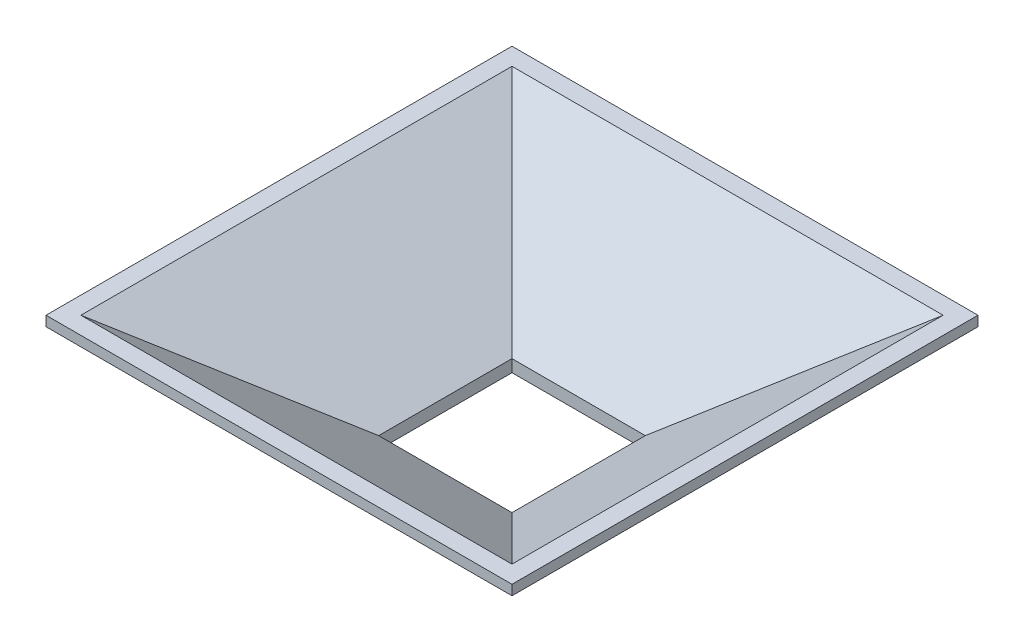
ISO-10303-21;
HEADER;
FILE_DESCRIPTION(('STEP AP214'),'2;1');
FILE_NAME('part.step','',(''),(''),'','','');
FILE_SCHEMA(('AUTOMOTIVE_DESIGN { 1 0 10303 214 1 1 1 1 }'));
ENDSEC;
DATA;
#1=APPLICATION_CONTEXT('core data for automotive mechanical design processes');
#2=APPLICATION_PROTOCOL_DEFINITION('international standard','automotive_design',2000,#1);
#3=PRODUCT_CONTEXT('',#1,'mechanical');
#4=PRODUCT('Part','Part','',(#3));
#5=PRODUCT_RELATED_PRODUCT_CATEGORY('part','',(#4));
#6=PRODUCT_DEFINITION_FORMATION('','',#4);
#7=PRODUCT_DEFINITION_CONTEXT('part definition',#1,'design');
#8=PRODUCT_DEFINITION('design','',#6,#7);
#9=PRODUCT_DEFINITION_SHAPE('','',#8);
#10=(LENGTH_UNIT() NAMED_UNIT(*) SI_UNIT(.MILLI.,.METRE.));
#11=(NAMED_UNIT(*) PLANE_ANGLE_UNIT() SI_UNIT($,.RADIAN.));
#12=(NAMED_UNIT(*) SI_UNIT($,.STERADIAN.) SOLID_ANGLE_UNIT());
#13=UNCERTAINTY_MEASURE_WITH_UNIT(LENGTH_MEASURE(1.E-05),#10,'distance_accuracy_value','');
#14=(GEOMETRIC_REPRESENTATION_CONTEXT(3) GLOBAL_UNCERTAINTY_ASSIGNED_CONTEXT((#13)) GLOBAL_UNIT_ASSIGNED_CONTEXT((#10,
#11,#12)) REPRESENTATION_CONTEXT('',''));
#15=CARTESIAN_POINT('',(0.,0.,0.));
#16=DIRECTION('',(0.,0.,1.));
#17=DIRECTION('',(1.,0.,0.));
#18=AXIS2_PLACEMENT_3D('',#15,#16,#17);
#19=CARTESIAN_POINT('',(0.,0.,0.));
#20=DIRECTION('',(0.,-1.,0.));
#21=DIRECTION('',(0.,0.,-1.));
#22=AXIS2_PLACEMENT_3D('',#19,#20,#21);
#23=PLANE('',#22);
#24=DIRECTION('',(0.,0.,1.));
#25=VECTOR('',#24,1.);
#26=CARTESIAN_POINT('',(0.,0.,0.));
#27=LINE('',#26,#25);
#28=CARTESIAN_POINT('',(0.,0.,-139.8));
#29=VERTEX_POINT('',#28);
#30=CARTESIAN_POINT('',(0.,0.,0.));
#31=VERTEX_POINT('',#30);
#32=EDGE_CURVE('E191',#29,#31,#27,.T.);
#33=ORIENTED_EDGE('',*,*,#32,.T.);
#34=DIRECTION('',(1.,0.,0.));
#35=VECTOR('',#34,1.);
#36=CARTESIAN_POINT('',(0.,0.,0.));
#37=LINE('',#36,#35);
#38=CARTESIAN_POINT('',(139.8,0.,0.));
#39=VERTEX_POINT('',#38);
#40=EDGE_CURVE('E207',#31,#39,#37,.T.);
#41=ORIENTED_EDGE('',*,*,#40,.T.);
#42=DIRECTION('',(0.,0.,-1.));
#43=VECTOR('',#42,1.);
#44=CARTESIAN_POINT('',(139.8,0.,0.));
#45=LINE('',#44,#43);
#46=CARTESIAN_POINT('',(139.8,0.,-139.8));
#47=VERTEX_POINT('',#46);
#48=EDGE_CURVE('E173',#39,#47,#45,.T.);
#49=ORIENTED_EDGE('',*,*,#48,.T.);
#50=DIRECTION('',(-1.,0.,0.));
#51=VECTOR('',#50,1.);
#52=CARTESIAN_POINT('',(0.,0.,-139.8));
#53=LINE('',#52,#51);
#54=EDGE_CURVE('E166',#47,#29,#53,.T.);
#55=ORIENTED_EDGE('',*,*,#54,.T.);
#56=EDGE_LOOP('',(#33,#41,#49,#55));
#57=FACE_BOUND('',#56,.T.);
#58=DIRECTION('',(1.,0.,0.));
#59=VECTOR('',#58,1.);
#60=CARTESIAN_POINT('',(0.,0.,-5.23034038686331));
#61=LINE('',#60,#59);
#62=CARTESIAN_POINT('',(5.23034038686331,0.,-5.23034038686331));
#63=VERTEX_POINT('',#62);
#64=CARTESIAN_POINT('',(134.569659613137,0.,-5.23034038686331));
#65=VERTEX_POINT('',#64);
#66=EDGE_CURVE('E251',#63,#65,#61,.T.);
#67=ORIENTED_EDGE('',*,*,#66,.F.);
#68=DIRECTION('',(0.,0.,1.));
#69=VECTOR('',#68,1.);
#70=CARTESIAN_POINT('',(5.23034038686331,0.,0.));
#71=LINE('',#70,#69);
#72=CARTESIAN_POINT('',(5.23034038686331,0.,-134.569659613137));
#73=VERTEX_POINT('',#72);
#74=EDGE_CURVE('E271',#73,#63,#71,.T.);
#75=ORIENTED_EDGE('',*,*,#74,.F.);
#76=DIRECTION('',(-1.,0.,0.));
#77=VECTOR('',#76,1.);
#78=CARTESIAN_POINT('',(0.,0.,-134.569659613137));
#79=LINE('',#78,#77);
#80=CARTESIAN_POINT('',(134.569659613137,0.,-134.569659613137));
#81=VERTEX_POINT('',#80);
#82=EDGE_CURVE('E265',#81,#73,#79,.T.);
#83=ORIENTED_EDGE('',*,*,#82,.F.);
#84=DIRECTION('',(0.,0.,-1.));
#85=VECTOR('',#84,1.);
#86=CARTESIAN_POINT('',(134.569659613137,0.,0.));
#87=LINE('',#86,#85);
#88=EDGE_CURVE('E261',#65,#81,#87,.T.);
#89=ORIENTED_EDGE('',*,*,#88,.F.);
#90=EDGE_LOOP('',(#67,#75,#83,#89));
#91=FACE_BOUND('',#90,.T.);
#92=ADVANCED_FACE('F45',(#57,#91),#23,.F.);
#93=CARTESIAN_POINT('',(0.,0.,0.));
#94=DIRECTION('',(-0.573576436351044,-0.819152044288993,0.));
#95=DIRECTION('',(0.819152044288993,-0.573576436351044,0.));
#96=AXIS2_PLACEMENT_3D('',#93,#94,#95);
#97=PLANE('',#96);
#98=DIRECTION('',(0.,0.,-1.));
#99=VECTOR('',#98,1.);
#100=CARTESIAN_POINT('',(49.9,-34.9403561566644,0.));
#101=LINE('',#100,#99);
#102=CARTESIAN_POINT('',(49.9,-34.9403561566644,-49.9));
#103=VERTEX_POINT('',#102);
#104=CARTESIAN_POINT('',(49.9,-34.9403561566644,-89.9));
#105=VERTEX_POINT('',#104);
#106=EDGE_CURVE('E145',#103,#105,#101,.T.);
#107=ORIENTED_EDGE('',*,*,#106,.F.);
#108=DIRECTION('',(-0.633687274224643,0.443712606279656,0.633687274224643));
#109=VECTOR('',#108,1.);
#110=CARTESIAN_POINT('',(0.,0.,0.));
#111=LINE('',#110,#109);
#112=CARTESIAN_POINT('',(4.28444402022636,-3.,-4.28444402022636));
#113=VERTEX_POINT('',#112);
#114=EDGE_CURVE('E155',#103,#113,#111,.T.);
#115=ORIENTED_EDGE('',*,*,#114,.T.);
#116=DIRECTION('',(0.,0.,1.));
#117=VECTOR('',#116,1.);
#118=CARTESIAN_POINT('',(4.28444402022636,-3.,0.));
#119=LINE('',#118,#117);
#120=CARTESIAN_POINT('',(4.28444402022637,-3.,-135.515555979774));
#121=VERTEX_POINT('',#120);
#122=EDGE_CURVE('E189',#121,#113,#119,.T.);
#123=ORIENTED_EDGE('',*,*,#122,.F.);
#124=DIRECTION('',(-0.633687274224643,0.443712606279656,-0.633687274224643));
#125=VECTOR('',#124,1.);
#126=CARTESIAN_POINT('',(0.,0.,-139.8));
#127=LINE('',#126,#125);
#128=EDGE_CURVE('E157',#105,#121,#127,.T.);
#129=ORIENTED_EDGE('',*,*,#128,.F.);
#130=EDGE_LOOP('',(#107,#115,#123,#129));
#131=FACE_BOUND('',#130,.T.);
#132=ADVANCED_FACE('F153',(#131),#97,.T.);
#133=CARTESIAN_POINT('',(0.,0.,-139.8));
#134=DIRECTION('',(0.,-0.819152044288993,-0.573576436351044));
#135=DIRECTION('',(0.,0.573576436351044,-0.819152044288993));
#136=AXIS2_PLACEMENT_3D('',#133,#134,#135);
#137=PLANE('',#136);
#138=DIRECTION('',(1.,0.,0.));
#139=VECTOR('',#138,1.);
#140=CARTESIAN_POINT('',(0.,-34.9403561566644,-89.9));
#141=LINE('',#140,#139);
#142=CARTESIAN_POINT('',(89.9,-34.9403561566644,-89.9));
#143=VERTEX_POINT('',#142);
#144=EDGE_CURVE('E188',#105,#143,#141,.T.);
#145=ORIENTED_EDGE('',*,*,#144,.F.);
#146=ORIENTED_EDGE('',*,*,#128,.T.);
#147=DIRECTION('',(-1.,0.,0.));
#148=VECTOR('',#147,1.);
#149=CARTESIAN_POINT('',(0.,-3.,-135.515555979774));
#150=LINE('',#149,#148);
#151=CARTESIAN_POINT('',(135.515555979774,-3.,-135.515555979774));
#152=VERTEX_POINT('',#151);
#153=EDGE_CURVE('E187',#152,#121,#150,.T.);
#154=ORIENTED_EDGE('',*,*,#153,.F.);
#155=DIRECTION('',(0.633687274224643,0.443712606279656,-0.633687274224643));
#156=VECTOR('',#155,1.);
#157=CARTESIAN_POINT('',(83.6619733003068,-39.3082694753429,-83.6619733003068));
#158=LINE('',#157,#156);
#159=EDGE_CURVE('E170',#143,#152,#158,.T.);
#160=ORIENTED_EDGE('',*,*,#159,.F.);
#161=EDGE_LOOP('',(#145,#146,#154,#160));
#162=FACE_BOUND('',#161,.T.);
#163=ADVANCED_FACE('F47',(#162),#137,.T.);
#164=CARTESIAN_POINT('',(139.8,0.,0.));
#165=DIRECTION('',(0.573576436351044,-0.819152044288993,0.));
#166=DIRECTION('',(0.819152044288993,0.573576436351044,0.));
#167=AXIS2_PLACEMENT_3D('',#164,#165,#166);
#168=PLANE('',#167);
#169=DIRECTION('',(0.,0.,1.));
#170=VECTOR('',#169,1.);
#171=CARTESIAN_POINT('',(89.9,-34.9403561566644,0.));
#172=LINE('',#171,#170);
#173=CARTESIAN_POINT('',(89.9,-34.9403561566644,-49.9));
#174=VERTEX_POINT('',#173);
#175=EDGE_CURVE('E286',#143,#174,#172,.T.);
#176=ORIENTED_EDGE('',*,*,#175,.F.);
#177=ORIENTED_EDGE('',*,*,#159,.T.);
#178=DIRECTION('',(0.,0.,-1.));
#179=VECTOR('',#178,1.);
#180=CARTESIAN_POINT('',(135.515555979774,-3.,0.));
#181=LINE('',#180,#179);
#182=CARTESIAN_POINT('',(135.515555979774,-3.,-4.28444402022636));
#183=VERTEX_POINT('',#182);
#184=EDGE_CURVE('E196',#183,#152,#181,.T.);
#185=ORIENTED_EDGE('',*,*,#184,.F.);
#186=DIRECTION('',(0.633687274224643,0.443712606279656,0.633687274224643));
#187=VECTOR('',#186,1.);
#188=CARTESIAN_POINT('',(83.6619733003068,-39.3082694753429,-56.1380266996932));
#189=LINE('',#188,#187);
#190=EDGE_CURVE('E165',#174,#183,#189,.T.);
#191=ORIENTED_EDGE('',*,*,#190,.F.);
#192=EDGE_LOOP('',(#176,#177,#185,#191));
#193=FACE_BOUND('',#192,.T.);
#194=ADVANCED_FACE('F341',(#193),#168,.T.);
#195=CARTESIAN_POINT('',(0.,0.,0.));
#196=DIRECTION('',(0.,-0.819152044288993,0.573576436351044));
#197=DIRECTION('',(0.,-0.573576436351044,-0.819152044288993));
#198=AXIS2_PLACEMENT_3D('',#195,#196,#197);
#199=PLANE('',#198);
#200=DIRECTION('',(-1.,0.,0.));
#201=VECTOR('',#200,1.);
#202=CARTESIAN_POINT('',(0.,-34.9403561566644,-49.9));
#203=LINE('',#202,#201);
#204=EDGE_CURVE('E132',#174,#103,#203,.T.);
#205=ORIENTED_EDGE('',*,*,#204,.F.);
#206=ORIENTED_EDGE('',*,*,#190,.T.);
#207=DIRECTION('',(1.,0.,0.));
#208=VECTOR('',#207,1.);
#209=CARTESIAN_POINT('',(0.,-3.,-4.28444402022636));
#210=LINE('',#209,#208);
#211=EDGE_CURVE('E54',#113,#183,#210,.T.);
#212=ORIENTED_EDGE('',*,*,#211,.F.);
#213=ORIENTED_EDGE('',*,*,#114,.F.);
#214=EDGE_LOOP('',(#205,#206,#212,#213));
#215=FACE_BOUND('',#214,.T.);
#216=ADVANCED_FACE('F161',(#215),#199,.T.);
#217=CARTESIAN_POINT('',(0.,-3.,0.));
#218=DIRECTION('',(-1.,0.,0.));
#219=DIRECTION('',(0.,0.,1.));
#220=AXIS2_PLACEMENT_3D('',#217,#218,#219);
#221=PLANE('',#220);
#222=ORIENTED_EDGE('',*,*,#32,.F.);
#223=DIRECTION('',(0.,1.,0.));
#224=VECTOR('',#223,1.);
#225=CARTESIAN_POINT('',(0.,-3.,-139.8));
#226=LINE('',#225,#224);
#227=CARTESIAN_POINT('',(0.,-3.,-139.8));
#228=VERTEX_POINT('',#227);
#229=EDGE_CURVE('E200',#228,#29,#226,.T.);
#230=ORIENTED_EDGE('',*,*,#229,.F.);
#231=DIRECTION('',(0.,0.,1.));
#232=VECTOR('',#231,1.);
#233=CARTESIAN_POINT('',(0.,-3.,0.));
#234=LINE('',#233,#232);
#235=CARTESIAN_POINT('',(0.,-3.,0.));
#236=VERTEX_POINT('',#235);
#237=EDGE_CURVE('E247',#228,#236,#234,.T.);
#238=ORIENTED_EDGE('',*,*,#237,.T.);
#239=DIRECTION('',(0.,1.,0.));
#240=VECTOR('',#239,1.);
#241=CARTESIAN_POINT('',(0.,-3.,0.));
#242=LINE('',#241,#240);
#243=EDGE_CURVE('E230',#236,#31,#242,.T.);
#244=ORIENTED_EDGE('',*,*,#243,.T.);
#245=EDGE_LOOP('',(#222,#230,#238,#244));
#246=FACE_BOUND('',#245,.T.);
#247=ADVANCED_FACE('F337',(#246),#221,.T.);
#248=CARTESIAN_POINT('',(0.,-3.,-139.8));
#249=DIRECTION('',(0.,0.,-1.));
#250=DIRECTION('',(-1.,0.,0.));
#251=AXIS2_PLACEMENT_3D('',#248,#249,#250);
#252=PLANE('',#251);
#253=ORIENTED_EDGE('',*,*,#54,.F.);
#254=DIRECTION('',(0.,1.,0.));
#255=VECTOR('',#254,1.);
#256=CARTESIAN_POINT('',(139.8,-3.,-139.8));
#257=LINE('',#256,#255);
#258=CARTESIAN_POINT('',(139.8,-3.,-139.8));
#259=VERTEX_POINT('',#258);
#260=EDGE_CURVE('E223',#259,#47,#257,.T.);
#261=ORIENTED_EDGE('',*,*,#260,.F.);
#262=DIRECTION('',(-1.,0.,0.));
#263=VECTOR('',#262,1.);
#264=CARTESIAN_POINT('',(0.,-3.,-139.8));
#265=LINE('',#264,#263);
#266=EDGE_CURVE('E235',#259,#228,#265,.T.);
#267=ORIENTED_EDGE('',*,*,#266,.T.);
#268=ORIENTED_EDGE('',*,*,#229,.T.);
#269=EDGE_LOOP('',(#253,#261,#267,#268));
#270=FACE_BOUND('',#269,.T.);
#271=ADVANCED_FACE('F373',(#270),#252,.T.);
#272=CARTESIAN_POINT('',(139.8,-3.,0.));
#273=DIRECTION('',(1.,0.,0.));
#274=DIRECTION('',(0.,0.,-1.));
#275=AXIS2_PLACEMENT_3D('',#272,#273,#274);
#276=PLANE('',#275);
#277=ORIENTED_EDGE('',*,*,#48,.F.);
#278=DIRECTION('',(0.,1.,0.));
#279=VECTOR('',#278,1.);
#280=CARTESIAN_POINT('',(139.8,-3.,0.));
#281=LINE('',#280,#279);
#282=CARTESIAN_POINT('',(139.8,-3.,0.));
#283=VERTEX_POINT('',#282);
#284=EDGE_CURVE('E221',#283,#39,#281,.T.);
#285=ORIENTED_EDGE('',*,*,#284,.F.);
#286=DIRECTION('',(0.,0.,-1.));
#287=VECTOR('',#286,1.);
#288=CARTESIAN_POINT('',(139.8,-3.,0.));
#289=LINE('',#288,#287);
#290=EDGE_CURVE('E242',#283,#259,#289,.T.);
#291=ORIENTED_EDGE('',*,*,#290,.T.);
#292=ORIENTED_EDGE('',*,*,#260,.T.);
#293=EDGE_LOOP('',(#277,#285,#291,#292));
#294=FACE_BOUND('',#293,.T.);
#295=ADVANCED_FACE('F219',(#294),#276,.T.);
#296=CARTESIAN_POINT('',(0.,-3.,0.));
#297=DIRECTION('',(0.,0.,1.));
#298=DIRECTION('',(1.,0.,0.));
#299=AXIS2_PLACEMENT_3D('',#296,#297,#298);
#300=PLANE('',#299);
#301=ORIENTED_EDGE('',*,*,#40,.F.);
#302=ORIENTED_EDGE('',*,*,#243,.F.);
#303=DIRECTION('',(1.,0.,0.));
#304=VECTOR('',#303,1.);
#305=CARTESIAN_POINT('',(0.,-3.,0.));
#306=LINE('',#305,#304);
#307=EDGE_CURVE('E228',#236,#283,#306,.T.);
#308=ORIENTED_EDGE('',*,*,#307,.T.);
#309=ORIENTED_EDGE('',*,*,#284,.T.);
#310=EDGE_LOOP('',(#301,#302,#308,#309));
#311=FACE_BOUND('',#310,.T.);
#312=ADVANCED_FACE('F226',(#311),#300,.T.);
#313=CARTESIAN_POINT('',(0.,-3.,0.));
#314=DIRECTION('',(0.,-1.,0.));
#315=DIRECTION('',(0.,0.,-1.));
#316=AXIS2_PLACEMENT_3D('',#313,#314,#315);
#317=PLANE('',#316);
#318=ORIENTED_EDGE('',*,*,#153,.T.);
#319=ORIENTED_EDGE('',*,*,#122,.T.);
#320=ORIENTED_EDGE('',*,*,#211,.T.);
#321=ORIENTED_EDGE('',*,*,#184,.T.);
#322=EDGE_LOOP('',(#318,#319,#320,#321));
#323=FACE_BOUND('',#322,.T.);
#324=ORIENTED_EDGE('',*,*,#237,.F.);
#325=ORIENTED_EDGE('',*,*,#266,.F.);
#326=ORIENTED_EDGE('',*,*,#290,.F.);
#327=ORIENTED_EDGE('',*,*,#307,.F.);
#328=EDGE_LOOP('',(#324,#325,#326,#327));
#329=FACE_BOUND('',#328,.T.);
#330=ADVANCED_FACE('F193',(#323,#329),#317,.T.);
#331=CARTESIAN_POINT('',(1.72072930905313,2.45745613286698,0.));
#332=DIRECTION('',(-0.573576436351044,-0.819152044288993,0.));
#333=DIRECTION('',(0.819152044288993,-0.573576436351044,0.));
#334=AXIS2_PLACEMENT_3D('',#331,#332,#333);
#335=PLANE('',#334);
#336=DIRECTION('',(-0.633687274224643,0.443712606279656,0.633687274224643));
#337=VECTOR('',#336,1.);
#338=CARTESIAN_POINT('',(1.02975400222503,2.94128225142478,-1.02975400222503));
#339=LINE('',#338,#337);
#340=CARTESIAN_POINT('',(49.9,-31.27803239038,-49.9));
#341=VERTEX_POINT('',#340);
#342=EDGE_CURVE('E260',#341,#63,#339,.T.);
#343=ORIENTED_EDGE('',*,*,#342,.F.);
#344=DIRECTION('',(0.,0.,-1.));
#345=VECTOR('',#344,1.);
#346=CARTESIAN_POINT('',(49.9,-31.27803239038,0.));
#347=LINE('',#346,#345);
#348=CARTESIAN_POINT('',(49.9,-31.27803239038,-89.9));
#349=VERTEX_POINT('',#348);
#350=EDGE_CURVE('E148',#341,#349,#347,.T.);
#351=ORIENTED_EDGE('',*,*,#350,.T.);
#352=DIRECTION('',(-0.633687274224643,0.443712606279656,-0.633687274224643));
#353=VECTOR('',#352,1.);
#354=CARTESIAN_POINT('',(1.02975400222503,2.94128225142478,-138.770245997775));
#355=LINE('',#354,#353);
#356=EDGE_CURVE('E255',#349,#73,#355,.T.);
#357=ORIENTED_EDGE('',*,*,#356,.T.);
#358=ORIENTED_EDGE('',*,*,#74,.T.);
#359=EDGE_LOOP('',(#343,#351,#357,#358));
#360=FACE_BOUND('',#359,.T.);
#361=ADVANCED_FACE('F303',(#360),#335,.F.);
#362=CARTESIAN_POINT('',(0.,2.45745613286698,-138.079270690947));
#363=DIRECTION('',(0.,-0.819152044288993,-0.573576436351044));
#364=DIRECTION('',(0.,0.573576436351044,-0.819152044288993));
#365=AXIS2_PLACEMENT_3D('',#362,#363,#364);
#366=PLANE('',#365);
#367=ORIENTED_EDGE('',*,*,#356,.F.);
#368=DIRECTION('',(1.,0.,0.));
#369=VECTOR('',#368,1.);
#370=CARTESIAN_POINT('',(0.,-31.27803239038,-89.9));
#371=LINE('',#370,#369);
#372=CARTESIAN_POINT('',(89.9,-31.27803239038,-89.9));
#373=VERTEX_POINT('',#372);
#374=EDGE_CURVE('E159',#349,#373,#371,.T.);
#375=ORIENTED_EDGE('',*,*,#374,.T.);
#376=DIRECTION('',(0.633687274224643,0.443712606279656,-0.633687274224643));
#377=VECTOR('',#376,1.);
#378=CARTESIAN_POINT('',(82.6322192980818,-36.3669872239182,-82.6322192980818));
#379=LINE('',#378,#377);
#380=EDGE_CURVE('E259',#373,#81,#379,.T.);
#381=ORIENTED_EDGE('',*,*,#380,.T.);
#382=ORIENTED_EDGE('',*,*,#82,.T.);
#383=EDGE_LOOP('',(#367,#375,#381,#382));
#384=FACE_BOUND('',#383,.T.);
#385=ADVANCED_FACE('F305',(#384),#366,.F.);
#386=CARTESIAN_POINT('',(138.079270690947,2.45745613286698,0.));
#387=DIRECTION('',(0.573576436351044,-0.819152044288993,0.));
#388=DIRECTION('',(0.819152044288993,0.573576436351044,0.));
#389=AXIS2_PLACEMENT_3D('',#386,#387,#388);
#390=PLANE('',#389);
#391=ORIENTED_EDGE('',*,*,#380,.F.);
#392=DIRECTION('',(0.,0.,1.));
#393=VECTOR('',#392,1.);
#394=CARTESIAN_POINT('',(89.9,-31.27803239038,0.));
#395=LINE('',#394,#393);
#396=CARTESIAN_POINT('',(89.9,-31.27803239038,-49.9));
#397=VERTEX_POINT('',#396);
#398=EDGE_CURVE('E138',#373,#397,#395,.T.);
#399=ORIENTED_EDGE('',*,*,#398,.T.);
#400=DIRECTION('',(0.633687274224643,0.443712606279656,0.633687274224643));
#401=VECTOR('',#400,1.);
#402=CARTESIAN_POINT('',(82.6322192980818,-36.3669872239182,-57.1677807019182));
#403=LINE('',#402,#401);
#404=EDGE_CURVE('E256',#397,#65,#403,.T.);
#405=ORIENTED_EDGE('',*,*,#404,.T.);
#406=ORIENTED_EDGE('',*,*,#88,.T.);
#407=EDGE_LOOP('',(#391,#399,#405,#406));
#408=FACE_BOUND('',#407,.T.);
#409=ADVANCED_FACE('F319',(#408),#390,.F.);
#410=CARTESIAN_POINT('',(0.,2.45745613286698,-1.72072930905313));
#411=DIRECTION('',(0.,-0.819152044288993,0.573576436351044));
#412=DIRECTION('',(0.,-0.573576436351044,-0.819152044288993));
#413=AXIS2_PLACEMENT_3D('',#410,#411,#412);
#414=PLANE('',#413);
#415=ORIENTED_EDGE('',*,*,#404,.F.);
#416=DIRECTION('',(-1.,0.,0.));
#417=VECTOR('',#416,1.);
#418=CARTESIAN_POINT('',(0.,-31.27803239038,-49.9));
#419=LINE('',#418,#417);
#420=EDGE_CURVE('E11',#397,#341,#419,.T.);
#421=ORIENTED_EDGE('',*,*,#420,.T.);
#422=ORIENTED_EDGE('',*,*,#342,.T.);
#423=ORIENTED_EDGE('',*,*,#66,.T.);
#424=EDGE_LOOP('',(#415,#421,#422,#423));
#425=FACE_BOUND('',#424,.T.);
#426=ADVANCED_FACE('F313',(#425),#414,.F.);
#427=CARTESIAN_POINT('',(49.9,-65.,-89.9));
#428=DIRECTION('',(0.,0.,-1.));
#429=DIRECTION('',(-1.,0.,0.));
#430=AXIS2_PLACEMENT_3D('',#427,#428,#429);
#431=PLANE('',#430);
#432=ORIENTED_EDGE('',*,*,#144,.T.);
#433=DIRECTION('',(0.,1.,0.));
#434=VECTOR('',#433,1.);
#435=CARTESIAN_POINT('',(89.9,-65.,-89.9));
#436=LINE('',#435,#434);
#437=EDGE_CURVE('E294',#143,#373,#436,.T.);
#438=ORIENTED_EDGE('',*,*,#437,.T.);
#439=ORIENTED_EDGE('',*,*,#374,.F.);
#440=DIRECTION('',(0.,1.,0.));
#441=VECTOR('',#440,1.);
#442=CARTESIAN_POINT('',(49.9,-65.,-89.9));
#443=LINE('',#442,#441);
#444=EDGE_CURVE('E139',#105,#349,#443,.T.);
#445=ORIENTED_EDGE('',*,*,#444,.F.);
#446=EDGE_LOOP('',(#432,#438,#439,#445));
#447=FACE_BOUND('',#446,.T.);
#448=ADVANCED_FACE('F326',(#447),#431,.F.);
#449=CARTESIAN_POINT('',(49.9,-65.,-49.9));
#450=DIRECTION('',(-1.,0.,0.));
#451=DIRECTION('',(0.,0.,1.));
#452=AXIS2_PLACEMENT_3D('',#449,#450,#451);
#453=PLANE('',#452);
#454=ORIENTED_EDGE('',*,*,#106,.T.);
#455=ORIENTED_EDGE('',*,*,#444,.T.);
#456=ORIENTED_EDGE('',*,*,#350,.F.);
#457=DIRECTION('',(0.,1.,0.));
#458=VECTOR('',#457,1.);
#459=CARTESIAN_POINT('',(49.9,-65.,-49.9));
#460=LINE('',#459,#458);
#461=EDGE_CURVE('E66',#103,#341,#460,.T.);
#462=ORIENTED_EDGE('',*,*,#461,.F.);
#463=EDGE_LOOP('',(#454,#455,#456,#462));
#464=FACE_BOUND('',#463,.T.);
#465=ADVANCED_FACE('F143',(#464),#453,.F.);
#466=CARTESIAN_POINT('',(89.9,-65.,-89.9));
#467=DIRECTION('',(1.,0.,0.));
#468=DIRECTION('',(0.,0.,-1.));
#469=AXIS2_PLACEMENT_3D('',#466,#467,#468);
#470=PLANE('',#469);
#471=ORIENTED_EDGE('',*,*,#175,.T.);
#472=DIRECTION('',(0.,1.,0.));
#473=VECTOR('',#472,1.);
#474=CARTESIAN_POINT('',(89.9,-65.,-49.9));
#475=LINE('',#474,#473);
#476=EDGE_CURVE('E61',#174,#397,#475,.T.);
#477=ORIENTED_EDGE('',*,*,#476,.T.);
#478=ORIENTED_EDGE('',*,*,#398,.F.);
#479=ORIENTED_EDGE('',*,*,#437,.F.);
#480=EDGE_LOOP('',(#471,#477,#478,#479));
#481=FACE_BOUND('',#480,.T.);
#482=ADVANCED_FACE('F315',(#481),#470,.F.);
#483=CARTESIAN_POINT('',(89.9,-65.,-49.9));
#484=DIRECTION('',(0.,0.,1.));
#485=DIRECTION('',(1.,0.,0.));
#486=AXIS2_PLACEMENT_3D('',#483,#484,#485);
#487=PLANE('',#486);
#488=ORIENTED_EDGE('',*,*,#204,.T.);
#489=ORIENTED_EDGE('',*,*,#461,.T.);
#490=ORIENTED_EDGE('',*,*,#420,.F.);
#491=ORIENTED_EDGE('',*,*,#476,.F.);
#492=EDGE_LOOP('',(#488,#489,#490,#491));
#493=FACE_BOUND('',#492,.T.);
#494=ADVANCED_FACE('F133',(#493),#487,.F.);
#495=CLOSED_SHELL('',(#92,#132,#163,#194,#216,#247,#271,#295,#312,#330,#361,#385,#409,#426,#448,
#465,#482,#494));
#496=MANIFOLD_SOLID_BREP('B2',#495);
#497=ADVANCED_BREP_SHAPE_REPRESENTATION('',(#18,#496),#14);
#498=SHAPE_DEFINITION_REPRESENTATION(#9,#497);
ENDSEC;
END-ISO-10303-21;
